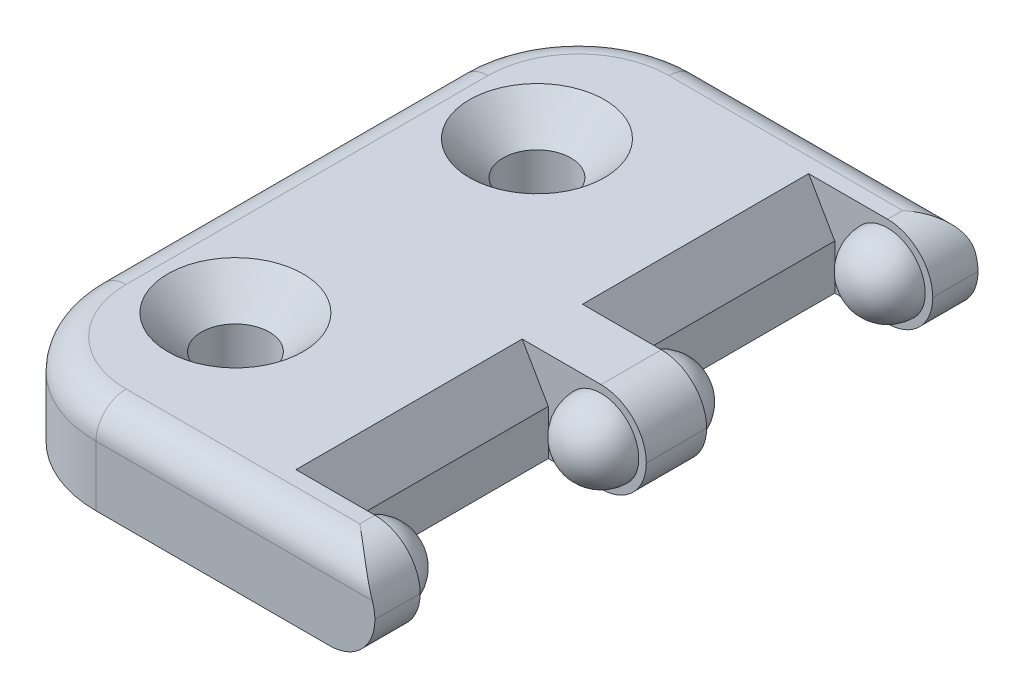
ISO-10303-21;
HEADER;
FILE_DESCRIPTION(('STEP AP214'),'2;1');
FILE_NAME('part.step','',(''),(''),'','','');
FILE_SCHEMA(('AUTOMOTIVE_DESIGN { 1 0 10303 214 1 1 1 1 }'));
ENDSEC;
DATA;
#1=APPLICATION_CONTEXT('core data for automotive mechanical design processes');
#2=APPLICATION_PROTOCOL_DEFINITION('international standard','automotive_design',2000,#1);
#3=PRODUCT_CONTEXT('',#1,'mechanical');
#4=PRODUCT('Part','Part','',(#3));
#5=PRODUCT_RELATED_PRODUCT_CATEGORY('part','',(#4));
#6=PRODUCT_DEFINITION_FORMATION('','',#4);
#7=PRODUCT_DEFINITION_CONTEXT('part definition',#1,'design');
#8=PRODUCT_DEFINITION('design','',#6,#7);
#9=PRODUCT_DEFINITION_SHAPE('','',#8);
#10=(LENGTH_UNIT() NAMED_UNIT(*) SI_UNIT(.MILLI.,.METRE.));
#11=(NAMED_UNIT(*) PLANE_ANGLE_UNIT() SI_UNIT($,.RADIAN.));
#12=(NAMED_UNIT(*) SI_UNIT($,.STERADIAN.) SOLID_ANGLE_UNIT());
#13=UNCERTAINTY_MEASURE_WITH_UNIT(LENGTH_MEASURE(1.E-05),#10,'distance_accuracy_value','');
#14=(GEOMETRIC_REPRESENTATION_CONTEXT(3) GLOBAL_UNCERTAINTY_ASSIGNED_CONTEXT((#13)) GLOBAL_UNIT_ASSIGNED_CONTEXT((#10,
#11,#12)) REPRESENTATION_CONTEXT('',''));
#15=CARTESIAN_POINT('',(0.,0.,0.));
#16=DIRECTION('',(0.,0.,1.));
#17=DIRECTION('',(1.,0.,0.));
#18=AXIS2_PLACEMENT_3D('',#15,#16,#17);
#19=CARTESIAN_POINT('',(-10.,6.,20.));
#20=DIRECTION('',(1.,0.,0.));
#21=DIRECTION('',(0.,0.,-1.));
#22=AXIS2_PLACEMENT_3D('',#19,#20,#21);
#23=PLANE('',#22);
#24=DIRECTION('',(0.,-1.,0.));
#25=VECTOR('',#24,1.);
#26=CARTESIAN_POINT('',(-10.,6.,12.));
#27=LINE('',#26,#25);
#28=CARTESIAN_POINT('',(-10.,0.,12.));
#29=VERTEX_POINT('',#28);
#30=CARTESIAN_POINT('',(-10.,4.,12.));
#31=VERTEX_POINT('',#30);
#32=EDGE_CURVE('E273',#29,#31,#27,.F.);
#33=ORIENTED_EDGE('',*,*,#32,.T.);
#34=DIRECTION('',(0.,0.,1.));
#35=VECTOR('',#34,1.);
#36=CARTESIAN_POINT('',(-10.,4.,-12.));
#37=LINE('',#36,#35);
#38=CARTESIAN_POINT('',(-10.,4.,-12.));
#39=VERTEX_POINT('',#38);
#40=EDGE_CURVE('E418',#31,#39,#37,.F.);
#41=ORIENTED_EDGE('',*,*,#40,.T.);
#42=DIRECTION('',(0.,-1.,0.));
#43=VECTOR('',#42,1.);
#44=CARTESIAN_POINT('',(-10.,6.,-12.));
#45=LINE('',#44,#43);
#46=CARTESIAN_POINT('',(-10.,0.,-12.));
#47=VERTEX_POINT('',#46);
#48=EDGE_CURVE('E287',#39,#47,#45,.T.);
#49=ORIENTED_EDGE('',*,*,#48,.T.);
#50=DIRECTION('',(0.,0.,1.));
#51=VECTOR('',#50,1.);
#52=CARTESIAN_POINT('',(-10.,0.,20.));
#53=LINE('',#52,#51);
#54=EDGE_CURVE('E280',#47,#29,#53,.T.);
#55=ORIENTED_EDGE('',*,*,#54,.T.);
#56=EDGE_LOOP('',(#33,#41,#49,#55));
#57=FACE_BOUND('',#56,.T.);
#58=ADVANCED_FACE('F43',(#57),#23,.F.);
#59=CARTESIAN_POINT('',(10.,6.,20.));
#60=DIRECTION('',(0.,0.,-1.));
#61=DIRECTION('',(-1.,0.,0.));
#62=AXIS2_PLACEMENT_3D('',#59,#60,#61);
#63=PLANE('',#62);
#64=CARTESIAN_POINT('',(13.5,3.,20.));
#65=DIRECTION('',(0.,0.,-1.));
#66=DIRECTION('',(-1.,0.,0.));
#67=AXIS2_PLACEMENT_3D('',#64,#65,#66);
#68=CIRCLE('',#67,3.);
#69=CARTESIAN_POINT('',(16.5,3.,20.));
#70=VERTEX_POINT('',#69);
#71=CARTESIAN_POINT('',(16.3284271247462,4.,20.));
#72=VERTEX_POINT('',#71);
#73=EDGE_CURVE('E269',#70,#72,#68,.F.);
#74=ORIENTED_EDGE('',*,*,#73,.T.);
#75=DIRECTION('',(1.,0.,0.));
#76=VECTOR('',#75,1.);
#77=CARTESIAN_POINT('',(-2.,4.,20.));
#78=LINE('',#77,#76);
#79=CARTESIAN_POINT('',(-2.,4.,20.));
#80=VERTEX_POINT('',#79);
#81=EDGE_CURVE('E316',#72,#80,#78,.F.);
#82=ORIENTED_EDGE('',*,*,#81,.T.);
#83=DIRECTION('',(0.,-1.,0.));
#84=VECTOR('',#83,1.);
#85=CARTESIAN_POINT('',(-2.,6.,20.));
#86=LINE('',#85,#84);
#87=CARTESIAN_POINT('',(-2.,0.,20.));
#88=VERTEX_POINT('',#87);
#89=EDGE_CURVE('E296',#80,#88,#86,.T.);
#90=ORIENTED_EDGE('',*,*,#89,.T.);
#91=DIRECTION('',(1.,0.,0.));
#92=VECTOR('',#91,1.);
#93=CARTESIAN_POINT('',(10.,0.,20.));
#94=LINE('',#93,#92);
#95=CARTESIAN_POINT('',(13.5,0.,20.));
#96=VERTEX_POINT('',#95);
#97=EDGE_CURVE('E209',#88,#96,#94,.T.);
#98=ORIENTED_EDGE('',*,*,#97,.T.);
#99=CARTESIAN_POINT('',(13.5,3.,20.));
#100=DIRECTION('',(0.,0.,-1.));
#101=DIRECTION('',(-1.,0.,0.));
#102=AXIS2_PLACEMENT_3D('',#99,#100,#101);
#103=CIRCLE('',#102,3.);
#104=EDGE_CURVE('E271',#96,#70,#103,.F.);
#105=ORIENTED_EDGE('',*,*,#104,.T.);
#106=EDGE_LOOP('',(#74,#82,#90,#98,#105));
#107=FACE_BOUND('',#106,.T.);
#108=ADVANCED_FACE('F347',(#107),#63,.F.);
#109=CARTESIAN_POINT('',(16.5,6.,17.));
#110=DIRECTION('',(0.,0.,1.));
#111=DIRECTION('',(1.,0.,0.));
#112=AXIS2_PLACEMENT_3D('',#109,#110,#111);
#113=PLANE('',#112);
#114=CARTESIAN_POINT('',(13.5,3.,17.));
#115=DIRECTION('',(0.,0.,-1.));
#116=DIRECTION('',(-1.,0.,0.));
#117=AXIS2_PLACEMENT_3D('',#114,#115,#116);
#118=CIRCLE('',#117,2.5);
#119=CARTESIAN_POINT('',(11.,3.,17.));
#120=VERTEX_POINT('',#119);
#121=EDGE_CURVE('E742',#120,#120,#118,.T.);
#122=ORIENTED_EDGE('',*,*,#121,.F.);
#123=EDGE_LOOP('',(#122));
#124=FACE_BOUND('',#123,.T.);
#125=CARTESIAN_POINT('',(13.5,3.,17.));
#126=DIRECTION('',(0.,0.,1.));
#127=DIRECTION('',(1.,0.,0.));
#128=AXIS2_PLACEMENT_3D('',#125,#126,#127);
#129=CIRCLE('',#128,3.);
#130=CARTESIAN_POINT('',(13.5,6.,17.));
#131=VERTEX_POINT('',#130);
#132=CARTESIAN_POINT('',(16.5,3.,17.));
#133=VERTEX_POINT('',#132);
#134=EDGE_CURVE('E270',#131,#133,#129,.F.);
#135=ORIENTED_EDGE('',*,*,#134,.T.);
#136=CARTESIAN_POINT('',(13.5,3.,17.));
#137=DIRECTION('',(0.,0.,1.));
#138=DIRECTION('',(1.,0.,0.));
#139=AXIS2_PLACEMENT_3D('',#136,#137,#138);
#140=CIRCLE('',#139,3.);
#141=CARTESIAN_POINT('',(13.5,0.,17.));
#142=VERTEX_POINT('',#141);
#143=EDGE_CURVE('E204',#133,#142,#140,.F.);
#144=ORIENTED_EDGE('',*,*,#143,.T.);
#145=DIRECTION('',(-1.,0.,0.));
#146=VECTOR('',#145,1.);
#147=CARTESIAN_POINT('',(16.5,0.,17.));
#148=LINE('',#147,#146);
#149=CARTESIAN_POINT('',(10.,0.,17.));
#150=VERTEX_POINT('',#149);
#151=EDGE_CURVE('E205',#142,#150,#148,.T.);
#152=ORIENTED_EDGE('',*,*,#151,.T.);
#153=DIRECTION('',(0.,-1.,0.));
#154=VECTOR('',#153,1.);
#155=CARTESIAN_POINT('',(10.,6.,17.));
#156=LINE('',#155,#154);
#157=CARTESIAN_POINT('',(10.,2.99999999999999,17.));
#158=VERTEX_POINT('',#157);
#159=EDGE_CURVE('E188',#158,#150,#156,.T.);
#160=ORIENTED_EDGE('',*,*,#159,.F.);
#161=DIRECTION('',(-0.499999999999998,0.86602540378444,0.));
#162=VECTOR('',#161,1.);
#163=CARTESIAN_POINT('',(10.3259618943233,2.43541743770059,17.));
#164=LINE('',#163,#162);
#165=CARTESIAN_POINT('',(8.26794919243113,6.,17.));
#166=VERTEX_POINT('',#165);
#167=EDGE_CURVE('E11',#158,#166,#164,.T.);
#168=ORIENTED_EDGE('',*,*,#167,.T.);
#169=DIRECTION('',(-1.,0.,0.));
#170=VECTOR('',#169,1.);
#171=CARTESIAN_POINT('',(16.5,6.,17.));
#172=LINE('',#171,#170);
#173=EDGE_CURVE('E235',#131,#166,#172,.T.);
#174=ORIENTED_EDGE('',*,*,#173,.F.);
#175=EDGE_LOOP('',(#135,#144,#152,#160,#168,#174));
#176=FACE_BOUND('',#175,.T.);
#177=ADVANCED_FACE('F203',(#124,#176),#113,.F.);
#178=CARTESIAN_POINT('',(10.,6.,17.));
#179=DIRECTION('',(-1.,0.,0.));
#180=DIRECTION('',(0.,0.,1.));
#181=AXIS2_PLACEMENT_3D('',#178,#179,#180);
#182=PLANE('',#181);
#183=DIRECTION('',(0.,-1.,0.));
#184=VECTOR('',#183,1.);
#185=CARTESIAN_POINT('',(10.,6.,2.));
#186=LINE('',#185,#184);
#187=CARTESIAN_POINT('',(10.,2.99999999999999,2.));
#188=VERTEX_POINT('',#187);
#189=CARTESIAN_POINT('',(10.,0.,2.));
#190=VERTEX_POINT('',#189);
#191=EDGE_CURVE('E199',#188,#190,#186,.T.);
#192=ORIENTED_EDGE('',*,*,#191,.F.);
#193=DIRECTION('',(0.,0.,1.));
#194=VECTOR('',#193,1.);
#195=CARTESIAN_POINT('',(10.,2.99999999999999,17.));
#196=LINE('',#195,#194);
#197=EDGE_CURVE('E56',#188,#158,#196,.T.);
#198=ORIENTED_EDGE('',*,*,#197,.T.);
#199=ORIENTED_EDGE('',*,*,#159,.T.);
#200=DIRECTION('',(0.,0.,-1.));
#201=VECTOR('',#200,1.);
#202=CARTESIAN_POINT('',(10.,0.,17.));
#203=LINE('',#202,#201);
#204=EDGE_CURVE('E195',#150,#190,#203,.T.);
#205=ORIENTED_EDGE('',*,*,#204,.T.);
#206=EDGE_LOOP('',(#192,#198,#199,#205));
#207=FACE_BOUND('',#206,.T.);
#208=ADVANCED_FACE('F194',(#207),#182,.F.);
#209=CARTESIAN_POINT('',(10.,6.,2.));
#210=DIRECTION('',(0.,0.,-1.));
#211=DIRECTION('',(-1.,0.,0.));
#212=AXIS2_PLACEMENT_3D('',#209,#210,#211);
#213=PLANE('',#212);
#214=CARTESIAN_POINT('',(13.5,3.,2.));
#215=DIRECTION('',(0.,0.,-1.));
#216=DIRECTION('',(-1.,0.,0.));
#217=AXIS2_PLACEMENT_3D('',#214,#215,#216);
#218=CIRCLE('',#217,2.5);
#219=CARTESIAN_POINT('',(11.,3.,2.));
#220=VERTEX_POINT('',#219);
#221=EDGE_CURVE('E286',#220,#220,#218,.T.);
#222=ORIENTED_EDGE('',*,*,#221,.T.);
#223=EDGE_LOOP('',(#222));
#224=FACE_BOUND('',#223,.T.);
#225=DIRECTION('',(1.,0.,0.));
#226=VECTOR('',#225,1.);
#227=CARTESIAN_POINT('',(10.,0.,2.));
#228=LINE('',#227,#226);
#229=CARTESIAN_POINT('',(13.5,0.,2.));
#230=VERTEX_POINT('',#229);
#231=EDGE_CURVE('E211',#190,#230,#228,.T.);
#232=ORIENTED_EDGE('',*,*,#231,.T.);
#233=CARTESIAN_POINT('',(13.5,3.,2.));
#234=DIRECTION('',(0.,0.,-1.));
#235=DIRECTION('',(-1.,0.,0.));
#236=AXIS2_PLACEMENT_3D('',#233,#234,#235);
#237=CIRCLE('',#236,3.);
#238=CARTESIAN_POINT('',(16.5,3.,2.));
#239=VERTEX_POINT('',#238);
#240=EDGE_CURVE('E262',#230,#239,#237,.F.);
#241=ORIENTED_EDGE('',*,*,#240,.T.);
#242=CARTESIAN_POINT('',(13.5,3.,2.));
#243=DIRECTION('',(0.,0.,-1.));
#244=DIRECTION('',(-1.,0.,0.));
#245=AXIS2_PLACEMENT_3D('',#242,#243,#244);
#246=CIRCLE('',#245,3.);
#247=CARTESIAN_POINT('',(13.5,6.,2.));
#248=VERTEX_POINT('',#247);
#249=EDGE_CURVE('E261',#239,#248,#246,.F.);
#250=ORIENTED_EDGE('',*,*,#249,.T.);
#251=DIRECTION('',(1.,0.,0.));
#252=VECTOR('',#251,1.);
#253=CARTESIAN_POINT('',(10.,6.,2.));
#254=LINE('',#253,#252);
#255=CARTESIAN_POINT('',(8.26794919243113,6.,2.));
#256=VERTEX_POINT('',#255);
#257=EDGE_CURVE('E481',#256,#248,#254,.T.);
#258=ORIENTED_EDGE('',*,*,#257,.F.);
#259=DIRECTION('',(0.499999999999998,-0.86602540378444,0.));
#260=VECTOR('',#259,1.);
#261=CARTESIAN_POINT('',(8.70096189432334,5.25,2.));
#262=LINE('',#261,#260);
#263=EDGE_CURVE('E55',#256,#188,#262,.T.);
#264=ORIENTED_EDGE('',*,*,#263,.T.);
#265=ORIENTED_EDGE('',*,*,#191,.T.);
#266=EDGE_LOOP('',(#232,#241,#250,#258,#264,#265));
#267=FACE_BOUND('',#266,.T.);
#268=ADVANCED_FACE('F471',(#224,#267),#213,.F.);
#269=CARTESIAN_POINT('',(10.,6.,-2.));
#270=DIRECTION('',(0.,0.,1.));
#271=DIRECTION('',(1.,0.,0.));
#272=AXIS2_PLACEMENT_3D('',#269,#270,#271);
#273=PLANE('',#272);
#274=CARTESIAN_POINT('',(13.5,3.,-2.));
#275=DIRECTION('',(0.,0.,-1.));
#276=DIRECTION('',(-1.,0.,0.));
#277=AXIS2_PLACEMENT_3D('',#274,#275,#276);
#278=CIRCLE('',#277,2.5);
#279=CARTESIAN_POINT('',(11.,3.,-2.));
#280=VERTEX_POINT('',#279);
#281=EDGE_CURVE('E739',#280,#280,#278,.T.);
#282=ORIENTED_EDGE('',*,*,#281,.F.);
#283=EDGE_LOOP('',(#282));
#284=FACE_BOUND('',#283,.T.);
#285=CARTESIAN_POINT('',(13.5,3.,-2.));
#286=DIRECTION('',(0.,0.,1.));
#287=DIRECTION('',(1.,0.,0.));
#288=AXIS2_PLACEMENT_3D('',#285,#286,#287);
#289=CIRCLE('',#288,3.);
#290=CARTESIAN_POINT('',(13.5,6.,-2.));
#291=VERTEX_POINT('',#290);
#292=CARTESIAN_POINT('',(16.5,3.,-2.));
#293=VERTEX_POINT('',#292);
#294=EDGE_CURVE('E260',#291,#293,#289,.F.);
#295=ORIENTED_EDGE('',*,*,#294,.T.);
#296=CARTESIAN_POINT('',(13.5,3.,-2.));
#297=DIRECTION('',(0.,0.,1.));
#298=DIRECTION('',(1.,0.,0.));
#299=AXIS2_PLACEMENT_3D('',#296,#297,#298);
#300=CIRCLE('',#299,3.);
#301=CARTESIAN_POINT('',(13.5,0.,-2.));
#302=VERTEX_POINT('',#301);
#303=EDGE_CURVE('E263',#293,#302,#300,.F.);
#304=ORIENTED_EDGE('',*,*,#303,.T.);
#305=DIRECTION('',(-1.,0.,0.));
#306=VECTOR('',#305,1.);
#307=CARTESIAN_POINT('',(10.,0.,-2.));
#308=LINE('',#307,#306);
#309=CARTESIAN_POINT('',(10.,0.,-2.));
#310=VERTEX_POINT('',#309);
#311=EDGE_CURVE('E220',#302,#310,#308,.T.);
#312=ORIENTED_EDGE('',*,*,#311,.T.);
#313=DIRECTION('',(0.,-1.,0.));
#314=VECTOR('',#313,1.);
#315=CARTESIAN_POINT('',(10.,6.,-2.));
#316=LINE('',#315,#314);
#317=CARTESIAN_POINT('',(10.,2.99999999999999,-2.));
#318=VERTEX_POINT('',#317);
#319=EDGE_CURVE('E232',#318,#310,#316,.T.);
#320=ORIENTED_EDGE('',*,*,#319,.F.);
#321=DIRECTION('',(-0.499999999999998,0.86602540378444,0.));
#322=VECTOR('',#321,1.);
#323=CARTESIAN_POINT('',(8.70096189432334,5.25,-2.));
#324=LINE('',#323,#322);
#325=CARTESIAN_POINT('',(8.26794919243113,6.,-2.));
#326=VERTEX_POINT('',#325);
#327=EDGE_CURVE('E399',#318,#326,#324,.T.);
#328=ORIENTED_EDGE('',*,*,#327,.T.);
#329=DIRECTION('',(-1.,0.,0.));
#330=VECTOR('',#329,1.);
#331=CARTESIAN_POINT('',(10.,6.,-2.));
#332=LINE('',#331,#330);
#333=EDGE_CURVE('E477',#291,#326,#332,.T.);
#334=ORIENTED_EDGE('',*,*,#333,.F.);
#335=EDGE_LOOP('',(#295,#304,#312,#320,#328,#334));
#336=FACE_BOUND('',#335,.T.);
#337=ADVANCED_FACE('F485',(#284,#336),#273,.F.);
#338=CARTESIAN_POINT('',(10.,6.,-17.));
#339=DIRECTION('',(-1.,0.,0.));
#340=DIRECTION('',(0.,0.,1.));
#341=AXIS2_PLACEMENT_3D('',#338,#339,#340);
#342=PLANE('',#341);
#343=DIRECTION('',(0.,-1.,0.));
#344=VECTOR('',#343,1.);
#345=CARTESIAN_POINT('',(10.,6.,-17.));
#346=LINE('',#345,#344);
#347=CARTESIAN_POINT('',(10.,2.99999999999999,-17.));
#348=VERTEX_POINT('',#347);
#349=CARTESIAN_POINT('',(10.,0.,-17.));
#350=VERTEX_POINT('',#349);
#351=EDGE_CURVE('E231',#348,#350,#346,.T.);
#352=ORIENTED_EDGE('',*,*,#351,.F.);
#353=DIRECTION('',(0.,0.,1.));
#354=VECTOR('',#353,1.);
#355=CARTESIAN_POINT('',(10.,2.99999999999999,-2.));
#356=LINE('',#355,#354);
#357=EDGE_CURVE('E405',#348,#318,#356,.T.);
#358=ORIENTED_EDGE('',*,*,#357,.T.);
#359=ORIENTED_EDGE('',*,*,#319,.T.);
#360=DIRECTION('',(0.,0.,-1.));
#361=VECTOR('',#360,1.);
#362=CARTESIAN_POINT('',(10.,0.,-17.));
#363=LINE('',#362,#361);
#364=EDGE_CURVE('E223',#310,#350,#363,.T.);
#365=ORIENTED_EDGE('',*,*,#364,.T.);
#366=EDGE_LOOP('',(#352,#358,#359,#365));
#367=FACE_BOUND('',#366,.T.);
#368=ADVANCED_FACE('F466',(#367),#342,.F.);
#369=CARTESIAN_POINT('',(16.5,6.,-17.));
#370=DIRECTION('',(0.,0.,-1.));
#371=DIRECTION('',(-1.,0.,0.));
#372=AXIS2_PLACEMENT_3D('',#369,#370,#371);
#373=PLANE('',#372);
#374=CARTESIAN_POINT('',(13.5,3.,-17.));
#375=DIRECTION('',(0.,0.,-1.));
#376=DIRECTION('',(-1.,0.,0.));
#377=AXIS2_PLACEMENT_3D('',#374,#375,#376);
#378=CIRCLE('',#377,2.5);
#379=CARTESIAN_POINT('',(11.,3.,-17.));
#380=VERTEX_POINT('',#379);
#381=EDGE_CURVE('E736',#380,#380,#378,.T.);
#382=ORIENTED_EDGE('',*,*,#381,.T.);
#383=EDGE_LOOP('',(#382));
#384=FACE_BOUND('',#383,.T.);
#385=CARTESIAN_POINT('',(13.5,3.,-17.));
#386=DIRECTION('',(0.,0.,-1.));
#387=DIRECTION('',(-1.,0.,0.));
#388=AXIS2_PLACEMENT_3D('',#385,#386,#387);
#389=CIRCLE('',#388,3.);
#390=CARTESIAN_POINT('',(13.5,0.,-17.));
#391=VERTEX_POINT('',#390);
#392=CARTESIAN_POINT('',(16.5,3.,-17.));
#393=VERTEX_POINT('',#392);
#394=EDGE_CURVE('E248',#391,#393,#389,.F.);
#395=ORIENTED_EDGE('',*,*,#394,.T.);
#396=CARTESIAN_POINT('',(13.5,3.,-17.));
#397=DIRECTION('',(0.,0.,-1.));
#398=DIRECTION('',(-1.,0.,0.));
#399=AXIS2_PLACEMENT_3D('',#396,#397,#398);
#400=CIRCLE('',#399,3.);
#401=CARTESIAN_POINT('',(13.5,6.,-17.));
#402=VERTEX_POINT('',#401);
#403=EDGE_CURVE('E252',#393,#402,#400,.F.);
#404=ORIENTED_EDGE('',*,*,#403,.T.);
#405=DIRECTION('',(1.,0.,0.));
#406=VECTOR('',#405,1.);
#407=CARTESIAN_POINT('',(16.5,6.,-17.));
#408=LINE('',#407,#406);
#409=CARTESIAN_POINT('',(8.26794919243113,6.,-17.));
#410=VERTEX_POINT('',#409);
#411=EDGE_CURVE('E236',#410,#402,#408,.T.);
#412=ORIENTED_EDGE('',*,*,#411,.F.);
#413=DIRECTION('',(0.499999999999998,-0.86602540378444,0.));
#414=VECTOR('',#413,1.);
#415=CARTESIAN_POINT('',(10.3259618943233,2.43541743770059,-17.));
#416=LINE('',#415,#414);
#417=EDGE_CURVE('E407',#410,#348,#416,.T.);
#418=ORIENTED_EDGE('',*,*,#417,.T.);
#419=ORIENTED_EDGE('',*,*,#351,.T.);
#420=DIRECTION('',(1.,0.,0.));
#421=VECTOR('',#420,1.);
#422=CARTESIAN_POINT('',(16.5,0.,-17.));
#423=LINE('',#422,#421);
#424=EDGE_CURVE('E228',#350,#391,#423,.T.);
#425=ORIENTED_EDGE('',*,*,#424,.T.);
#426=EDGE_LOOP('',(#395,#404,#412,#418,#419,#425));
#427=FACE_BOUND('',#426,.T.);
#428=ADVANCED_FACE('F464',(#384,#427),#373,.F.);
#429=CARTESIAN_POINT('',(10.,6.,-20.));
#430=DIRECTION('',(0.,0.,1.));
#431=DIRECTION('',(1.,0.,0.));
#432=AXIS2_PLACEMENT_3D('',#429,#430,#431);
#433=PLANE('',#432);
#434=DIRECTION('',(0.,-1.,0.));
#435=VECTOR('',#434,1.);
#436=CARTESIAN_POINT('',(-2.00000000000001,6.,-20.));
#437=LINE('',#436,#435);
#438=CARTESIAN_POINT('',(-2.00000000000001,0.,-20.));
#439=VERTEX_POINT('',#438);
#440=CARTESIAN_POINT('',(-2.00000000000001,4.,-20.));
#441=VERTEX_POINT('',#440);
#442=EDGE_CURVE('E294',#439,#441,#437,.F.);
#443=ORIENTED_EDGE('',*,*,#442,.T.);
#444=DIRECTION('',(-1.,0.,0.));
#445=VECTOR('',#444,1.);
#446=CARTESIAN_POINT('',(13.5,4.,-20.));
#447=LINE('',#446,#445);
#448=CARTESIAN_POINT('',(16.3284271247462,4.,-20.));
#449=VERTEX_POINT('',#448);
#450=EDGE_CURVE('E380',#441,#449,#447,.F.);
#451=ORIENTED_EDGE('',*,*,#450,.T.);
#452=CARTESIAN_POINT('',(13.5,3.,-20.));
#453=DIRECTION('',(0.,0.,1.));
#454=DIRECTION('',(1.,0.,0.));
#455=AXIS2_PLACEMENT_3D('',#452,#453,#454);
#456=CIRCLE('',#455,3.);
#457=CARTESIAN_POINT('',(16.5,3.,-20.));
#458=VERTEX_POINT('',#457);
#459=EDGE_CURVE('E250',#449,#458,#456,.F.);
#460=ORIENTED_EDGE('',*,*,#459,.T.);
#461=CARTESIAN_POINT('',(13.5,3.,-20.));
#462=DIRECTION('',(0.,0.,1.));
#463=DIRECTION('',(1.,0.,0.));
#464=AXIS2_PLACEMENT_3D('',#461,#462,#463);
#465=CIRCLE('',#464,3.);
#466=CARTESIAN_POINT('',(13.5,0.,-20.));
#467=VERTEX_POINT('',#466);
#468=EDGE_CURVE('E244',#458,#467,#465,.F.);
#469=ORIENTED_EDGE('',*,*,#468,.T.);
#470=DIRECTION('',(-1.,0.,0.));
#471=VECTOR('',#470,1.);
#472=CARTESIAN_POINT('',(10.,0.,-20.));
#473=LINE('',#472,#471);
#474=EDGE_CURVE('E230',#467,#439,#473,.T.);
#475=ORIENTED_EDGE('',*,*,#474,.T.);
#476=EDGE_LOOP('',(#443,#451,#460,#469,#475));
#477=FACE_BOUND('',#476,.T.);
#478=ADVANCED_FACE('F442',(#477),#433,.F.);
#479=CARTESIAN_POINT('',(0.,6.,0.));
#480=DIRECTION('',(0.,1.,0.));
#481=DIRECTION('',(0.,0.,1.));
#482=AXIS2_PLACEMENT_3D('',#479,#480,#481);
#483=PLANE('',#482);
#484=CARTESIAN_POINT('',(-2.75,6.,-10.));
#485=DIRECTION('',(0.,1.,0.));
#486=DIRECTION('',(0.,0.,1.));
#487=AXIS2_PLACEMENT_3D('',#484,#485,#486);
#488=CIRCLE('',#487,4.48);
#489=CARTESIAN_POINT('',(-2.75,6.,-5.52));
#490=VERTEX_POINT('',#489);
#491=EDGE_CURVE('E422',#490,#490,#488,.T.);
#492=ORIENTED_EDGE('',*,*,#491,.F.);
#493=EDGE_LOOP('',(#492));
#494=FACE_BOUND('',#493,.T.);
#495=CARTESIAN_POINT('',(-2.75,6.,10.));
#496=DIRECTION('',(0.,1.,0.));
#497=DIRECTION('',(0.,0.,1.));
#498=AXIS2_PLACEMENT_3D('',#495,#496,#497);
#499=CIRCLE('',#498,4.48);
#500=CARTESIAN_POINT('',(-2.75,6.,14.48));
#501=VERTEX_POINT('',#500);
#502=EDGE_CURVE('E760',#501,#501,#499,.T.);
#503=ORIENTED_EDGE('',*,*,#502,.F.);
#504=EDGE_LOOP('',(#503));
#505=FACE_BOUND('',#504,.T.);
#506=DIRECTION('',(0.,0.,-1.));
#507=VECTOR('',#506,1.);
#508=CARTESIAN_POINT('',(8.26794919243113,6.,-17.));
#509=LINE('',#508,#507);
#510=EDGE_CURVE('E404',#326,#410,#509,.T.);
#511=ORIENTED_EDGE('',*,*,#510,.T.);
#512=ORIENTED_EDGE('',*,*,#411,.T.);
#513=DIRECTION('',(0.,0.,-1.));
#514=VECTOR('',#513,1.);
#515=CARTESIAN_POINT('',(13.5,6.,-20.));
#516=LINE('',#515,#514);
#517=CARTESIAN_POINT('',(13.5,6.,-18.));
#518=VERTEX_POINT('',#517);
#519=EDGE_CURVE('E245',#402,#518,#516,.T.);
#520=ORIENTED_EDGE('',*,*,#519,.T.);
#521=DIRECTION('',(-1.,0.,0.));
#522=VECTOR('',#521,1.);
#523=CARTESIAN_POINT('',(-2.00000000000001,6.,-18.));
#524=LINE('',#523,#522);
#525=CARTESIAN_POINT('',(-2.00000000000001,6.,-18.));
#526=VERTEX_POINT('',#525);
#527=EDGE_CURVE('E306',#518,#526,#524,.T.);
#528=ORIENTED_EDGE('',*,*,#527,.T.);
#529=CARTESIAN_POINT('',(-2.,6.,-12.));
#530=DIRECTION('',(0.,1.,0.));
#531=DIRECTION('',(0.,0.,1.));
#532=AXIS2_PLACEMENT_3D('',#529,#530,#531);
#533=CIRCLE('',#532,6.);
#534=CARTESIAN_POINT('',(-8.,6.,-12.));
#535=VERTEX_POINT('',#534);
#536=EDGE_CURVE('E302',#526,#535,#533,.T.);
#537=ORIENTED_EDGE('',*,*,#536,.T.);
#538=DIRECTION('',(0.,0.,1.));
#539=VECTOR('',#538,1.);
#540=CARTESIAN_POINT('',(-8.,6.,12.));
#541=LINE('',#540,#539);
#542=CARTESIAN_POINT('',(-8.,6.,12.));
#543=VERTEX_POINT('',#542);
#544=EDGE_CURVE('E297',#535,#543,#541,.T.);
#545=ORIENTED_EDGE('',*,*,#544,.T.);
#546=CARTESIAN_POINT('',(-2.,6.,12.));
#547=DIRECTION('',(0.,1.,0.));
#548=DIRECTION('',(0.,0.,1.));
#549=AXIS2_PLACEMENT_3D('',#546,#547,#548);
#550=CIRCLE('',#549,6.);
#551=CARTESIAN_POINT('',(-2.,6.,18.));
#552=VERTEX_POINT('',#551);
#553=EDGE_CURVE('E305',#543,#552,#550,.T.);
#554=ORIENTED_EDGE('',*,*,#553,.T.);
#555=DIRECTION('',(1.,0.,0.));
#556=VECTOR('',#555,1.);
#557=CARTESIAN_POINT('',(13.5,6.,18.));
#558=LINE('',#557,#556);
#559=CARTESIAN_POINT('',(13.5,6.,18.));
#560=VERTEX_POINT('',#559);
#561=EDGE_CURVE('E308',#552,#560,#558,.T.);
#562=ORIENTED_EDGE('',*,*,#561,.T.);
#563=DIRECTION('',(0.,0.,-1.));
#564=VECTOR('',#563,1.);
#565=CARTESIAN_POINT('',(13.5,6.,17.));
#566=LINE('',#565,#564);
#567=EDGE_CURVE('E196',#560,#131,#566,.T.);
#568=ORIENTED_EDGE('',*,*,#567,.T.);
#569=ORIENTED_EDGE('',*,*,#173,.T.);
#570=DIRECTION('',(0.,0.,-1.));
#571=VECTOR('',#570,1.);
#572=CARTESIAN_POINT('',(8.26794919243113,6.,2.));
#573=LINE('',#572,#571);
#574=EDGE_CURVE('E412',#166,#256,#573,.T.);
#575=ORIENTED_EDGE('',*,*,#574,.T.);
#576=ORIENTED_EDGE('',*,*,#257,.T.);
#577=DIRECTION('',(0.,0.,-1.));
#578=VECTOR('',#577,1.);
#579=CARTESIAN_POINT('',(13.5,6.,-2.));
#580=LINE('',#579,#578);
#581=EDGE_CURVE('E239',#248,#291,#580,.T.);
#582=ORIENTED_EDGE('',*,*,#581,.T.);
#583=ORIENTED_EDGE('',*,*,#333,.T.);
#584=EDGE_LOOP('',(#511,#512,#520,#528,#537,#545,#554,#562,#568,#569,#575,#576,#582,#583));
#585=FACE_BOUND('',#584,.T.);
#586=ADVANCED_FACE('F454',(#494,#505,#585),#483,.T.);
#587=CARTESIAN_POINT('',(0.,0.,0.));
#588=DIRECTION('',(0.,1.,0.));
#589=DIRECTION('',(0.,0.,1.));
#590=AXIS2_PLACEMENT_3D('',#587,#588,#589);
#591=PLANE('',#590);
#592=CARTESIAN_POINT('',(-2.75,0.,-10.));
#593=DIRECTION('',(0.,1.,0.));
#594=DIRECTION('',(0.,0.,1.));
#595=AXIS2_PLACEMENT_3D('',#592,#593,#594);
#596=CIRCLE('',#595,2.25);
#597=CARTESIAN_POINT('',(-2.75,0.,-7.75));
#598=VERTEX_POINT('',#597);
#599=EDGE_CURVE('E759',#598,#598,#596,.T.);
#600=ORIENTED_EDGE('',*,*,#599,.T.);
#601=EDGE_LOOP('',(#600));
#602=FACE_BOUND('',#601,.T.);
#603=CARTESIAN_POINT('',(-2.75,0.,10.));
#604=DIRECTION('',(0.,1.,0.));
#605=DIRECTION('',(0.,0.,1.));
#606=AXIS2_PLACEMENT_3D('',#603,#604,#605);
#607=CIRCLE('',#606,2.25);
#608=CARTESIAN_POINT('',(-2.75,0.,12.25));
#609=VERTEX_POINT('',#608);
#610=EDGE_CURVE('E753',#609,#609,#607,.T.);
#611=ORIENTED_EDGE('',*,*,#610,.T.);
#612=EDGE_LOOP('',(#611));
#613=FACE_BOUND('',#612,.T.);
#614=ORIENTED_EDGE('',*,*,#54,.F.);
#615=CARTESIAN_POINT('',(-2.,0.,-12.));
#616=DIRECTION('',(0.,1.,0.));
#617=DIRECTION('',(0.,0.,1.));
#618=AXIS2_PLACEMENT_3D('',#615,#616,#617);
#619=CIRCLE('',#618,8.);
#620=EDGE_CURVE('E291',#47,#439,#619,.F.);
#621=ORIENTED_EDGE('',*,*,#620,.T.);
#622=ORIENTED_EDGE('',*,*,#474,.F.);
#623=DIRECTION('',(0.,0.,-1.));
#624=VECTOR('',#623,1.);
#625=CARTESIAN_POINT('',(13.5,0.,0.));
#626=LINE('',#625,#624);
#627=EDGE_CURVE('E259',#467,#391,#626,.F.);
#628=ORIENTED_EDGE('',*,*,#627,.T.);
#629=ORIENTED_EDGE('',*,*,#424,.F.);
#630=ORIENTED_EDGE('',*,*,#364,.F.);
#631=ORIENTED_EDGE('',*,*,#311,.F.);
#632=DIRECTION('',(0.,0.,-1.));
#633=VECTOR('',#632,1.);
#634=CARTESIAN_POINT('',(13.5,0.,0.));
#635=LINE('',#634,#633);
#636=EDGE_CURVE('E253',#302,#230,#635,.F.);
#637=ORIENTED_EDGE('',*,*,#636,.T.);
#638=ORIENTED_EDGE('',*,*,#231,.F.);
#639=ORIENTED_EDGE('',*,*,#204,.F.);
#640=ORIENTED_EDGE('',*,*,#151,.F.);
#641=DIRECTION('',(0.,0.,-1.));
#642=VECTOR('',#641,1.);
#643=CARTESIAN_POINT('',(13.5,0.,0.));
#644=LINE('',#643,#642);
#645=EDGE_CURVE('E254',#142,#96,#644,.F.);
#646=ORIENTED_EDGE('',*,*,#645,.T.);
#647=ORIENTED_EDGE('',*,*,#97,.F.);
#648=CARTESIAN_POINT('',(-2.,0.,12.));
#649=DIRECTION('',(0.,1.,0.));
#650=DIRECTION('',(0.,0.,1.));
#651=AXIS2_PLACEMENT_3D('',#648,#649,#650);
#652=CIRCLE('',#651,8.);
#653=EDGE_CURVE('E293',#88,#29,#652,.F.);
#654=ORIENTED_EDGE('',*,*,#653,.T.);
#655=EDGE_LOOP('',(#614,#621,#622,#628,#629,#630,#631,#637,#638,#639,#640,#646,#647,#654));
#656=FACE_BOUND('',#655,.T.);
#657=ADVANCED_FACE('F214',(#602,#613,#656),#591,.F.);
#658=CARTESIAN_POINT('',(13.5,3.,-20.));
#659=DIRECTION('',(0.,0.,-1.));
#660=DIRECTION('',(-1.,0.,0.));
#661=AXIS2_PLACEMENT_3D('',#658,#659,#660);
#662=CYLINDRICAL_SURFACE('',#661,3.);
#663=DIRECTION('',(0.,0.,-1.));
#664=VECTOR('',#663,1.);
#665=CARTESIAN_POINT('',(16.5,3.,-20.));
#666=LINE('',#665,#664);
#667=EDGE_CURVE('E278',#393,#458,#666,.T.);
#668=ORIENTED_EDGE('',*,*,#667,.F.);
#669=ORIENTED_EDGE('',*,*,#394,.F.);
#670=ORIENTED_EDGE('',*,*,#627,.F.);
#671=ORIENTED_EDGE('',*,*,#468,.F.);
#672=EDGE_LOOP('',(#668,#669,#670,#671));
#673=FACE_BOUND('',#672,.T.);
#674=ADVANCED_FACE('F366',(#673),#662,.T.);
#675=CARTESIAN_POINT('',(13.5,3.,0.));
#676=DIRECTION('',(0.,0.,1.));
#677=DIRECTION('',(1.,0.,0.));
#678=AXIS2_PLACEMENT_3D('',#675,#676,#677);
#679=CYLINDRICAL_SURFACE('',#678,3.);
#680=ORIENTED_EDGE('',*,*,#459,.F.);
#681=CARTESIAN_POINT('',(16.3284271247462,4.,-20.));
#682=CARTESIAN_POINT('',(16.3085070502688,4.05638405555257,-20.0000084449649));
#683=CARTESIAN_POINT('',(16.286886973048,4.11213090524145,-19.9976165290429));
#684=CARTESIAN_POINT('',(16.2405472122196,4.22185097214105,-19.9884161031397));
#685=CARTESIAN_POINT('',(16.2158323213147,4.27582677235699,-19.9816143557198));
#686=CARTESIAN_POINT('',(16.1638043245425,4.38114703210529,-19.9640650089645));
#687=CARTESIAN_POINT('',(16.1365199223747,4.43251253251163,-19.9533578782159));
#688=CARTESIAN_POINT('',(16.0794299188087,4.53293300898971,-19.928383343086));
#689=CARTESIAN_POINT('',(16.049623133967,4.58198688350807,-19.9141142613294));
#690=CARTESIAN_POINT('',(15.9427647951933,4.74710684622474,-19.8593269063569));
#691=CARTESIAN_POINT('',(15.8600093087302,4.85695114231588,-19.8107991236013));
#692=CARTESIAN_POINT('',(15.6844718166551,5.06066196172696,-19.699579870891));
#693=CARTESIAN_POINT('',(15.5916463864372,5.15445439532711,-19.6368256750297));
#694=CARTESIAN_POINT('',(15.3616923966539,5.35925720363039,-19.4749333169946));
#695=CARTESIAN_POINT('',(15.2213141580627,5.46289727870954,-19.3711102120254));
#696=CARTESIAN_POINT('',(14.9322217094586,5.64153331793482,-19.1512915720566));
#697=CARTESIAN_POINT('',(14.783496123637,5.7164890478937,-19.0352792281827));
#698=CARTESIAN_POINT('',(14.5408862776506,5.81536669032298,-18.8432419274776));
#699=CARTESIAN_POINT('',(14.4485230844081,5.84775479636274,-18.769505033522));
#700=CARTESIAN_POINT('',(14.2625127889543,5.90310220476015,-18.6201250475232));
#701=CARTESIAN_POINT('',(14.1688652730567,5.92605839166327,-18.5444813343815));
#702=CARTESIAN_POINT('',(13.8871097494622,5.98105514873023,-18.3160659756589));
#703=CARTESIAN_POINT('',(13.6976116741131,5.9994534063341,-18.1613491422741));
#704=CARTESIAN_POINT('',(13.5056567697599,5.99999599518123,-18.004618731357));
#705=CARTESIAN_POINT('',(13.502828339584,5.99999999478464,-18.002309327745));
#706=CARTESIAN_POINT('',(13.5,6.,-18.));
#707=B_SPLINE_CURVE_WITH_KNOTS('',3,(#681,#682,#683,#684,#685,#686,#687,#688,#689,#690,#691,
#692,#693,#694,#695,#696,#697,#698,#699,#700,#701,#702,#703,#704,#705,#706),.UNSPECIFIED.,.F.,
.F.,(4,2,2,2,2,2,2,2,2,2,2,2,4),(0.,0.179272158824226,0.358270048541719,0.535463494925258,
0.712740542250159,1.14766579663324,1.58454732757419,2.19039501983591,2.79708941843105,
3.16434808038176,3.53172795410126,4.26418943717289,4.2751438948957),.UNSPECIFIED.);
#708=EDGE_CURVE('E369',#449,#518,#707,.T.);
#709=ORIENTED_EDGE('',*,*,#708,.T.);
#710=ORIENTED_EDGE('',*,*,#519,.F.);
#711=ORIENTED_EDGE('',*,*,#403,.F.);
#712=ORIENTED_EDGE('',*,*,#667,.T.);
#713=EDGE_LOOP('',(#680,#709,#710,#711,#712));
#714=FACE_BOUND('',#713,.T.);
#715=ADVANCED_FACE('F363',(#714),#679,.T.);
#716=CARTESIAN_POINT('',(13.5,3.,0.));
#717=DIRECTION('',(0.,0.,1.));
#718=DIRECTION('',(1.,0.,0.));
#719=AXIS2_PLACEMENT_3D('',#716,#717,#718);
#720=CYLINDRICAL_SURFACE('',#719,3.);
#721=ORIENTED_EDGE('',*,*,#581,.F.);
#722=ORIENTED_EDGE('',*,*,#249,.F.);
#723=DIRECTION('',(0.,0.,-1.));
#724=VECTOR('',#723,1.);
#725=CARTESIAN_POINT('',(16.5,3.,2.));
#726=LINE('',#725,#724);
#727=EDGE_CURVE('E276',#293,#239,#726,.F.);
#728=ORIENTED_EDGE('',*,*,#727,.F.);
#729=ORIENTED_EDGE('',*,*,#294,.F.);
#730=EDGE_LOOP('',(#721,#722,#728,#729));
#731=FACE_BOUND('',#730,.T.);
#732=ADVANCED_FACE('F362',(#731),#720,.T.);
#733=CARTESIAN_POINT('',(13.5,3.,-2.));
#734=DIRECTION('',(0.,0.,-1.));
#735=DIRECTION('',(-1.,0.,0.));
#736=AXIS2_PLACEMENT_3D('',#733,#734,#735);
#737=CYLINDRICAL_SURFACE('',#736,3.);
#738=ORIENTED_EDGE('',*,*,#240,.F.);
#739=ORIENTED_EDGE('',*,*,#636,.F.);
#740=ORIENTED_EDGE('',*,*,#303,.F.);
#741=ORIENTED_EDGE('',*,*,#727,.T.);
#742=EDGE_LOOP('',(#738,#739,#740,#741));
#743=FACE_BOUND('',#742,.T.);
#744=ADVANCED_FACE('F331',(#743),#737,.T.);
#745=CARTESIAN_POINT('',(13.5,3.,0.));
#746=DIRECTION('',(0.,0.,1.));
#747=DIRECTION('',(1.,0.,0.));
#748=AXIS2_PLACEMENT_3D('',#745,#746,#747);
#749=CYLINDRICAL_SURFACE('',#748,3.);
#750=ORIENTED_EDGE('',*,*,#567,.F.);
#751=CARTESIAN_POINT('',(16.3284271247462,4.,20.));
#752=CARTESIAN_POINT('',(16.3085070502688,4.05638405555257,20.0000084449649));
#753=CARTESIAN_POINT('',(16.286886973048,4.11213090524145,19.9976165290429));
#754=CARTESIAN_POINT('',(16.2405472122196,4.22185097214105,19.9884161031397));
#755=CARTESIAN_POINT('',(16.2158323213147,4.27582677235699,19.9816143557198));
#756=CARTESIAN_POINT('',(16.1638043245425,4.38114703210529,19.9640650089645));
#757=CARTESIAN_POINT('',(16.1365199223747,4.43251253251162,19.9533578782159));
#758=CARTESIAN_POINT('',(16.0794299188087,4.53293300898971,19.928383343086));
#759=CARTESIAN_POINT('',(16.049623133967,4.58198688350807,19.9141142613294));
#760=CARTESIAN_POINT('',(15.9427647951933,4.74710684622474,19.8593269063569));
#761=CARTESIAN_POINT('',(15.8600093087302,4.85695114231588,19.8107991236012));
#762=CARTESIAN_POINT('',(15.6844718166551,5.06066196172696,19.699579870891));
#763=CARTESIAN_POINT('',(15.5916463864372,5.15445439532711,19.6368256750297));
#764=CARTESIAN_POINT('',(15.3616923966539,5.35925720363039,19.4749333169946));
#765=CARTESIAN_POINT('',(15.2213141580627,5.46289727870954,19.3711102120254));
#766=CARTESIAN_POINT('',(14.9322217094586,5.64153331793483,19.1512915720566));
#767=CARTESIAN_POINT('',(14.783496123637,5.7164890478937,19.0352792281827));
#768=CARTESIAN_POINT('',(14.5408862776506,5.81536669032298,18.8432419274776));
#769=CARTESIAN_POINT('',(14.4485230844081,5.84775479636274,18.769505033522));
#770=CARTESIAN_POINT('',(14.2625127889543,5.90310220476016,18.6201250475232));
#771=CARTESIAN_POINT('',(14.1688652730567,5.92605839166327,18.5444813343815));
#772=CARTESIAN_POINT('',(13.8871097494622,5.98105514873023,18.3160659756589));
#773=CARTESIAN_POINT('',(13.6976116741132,5.9994534063341,18.161349142274));
#774=CARTESIAN_POINT('',(13.5056567697599,5.99999599518123,18.004618731357));
#775=CARTESIAN_POINT('',(13.502828339584,5.99999999478464,18.002309327745));
#776=CARTESIAN_POINT('',(13.5,6.,18.));
#777=B_SPLINE_CURVE_WITH_KNOTS('',3,(#751,#752,#753,#754,#755,#756,#757,#758,#759,#760,#761,
#762,#763,#764,#765,#766,#767,#768,#769,#770,#771,#772,#773,#774,#775,#776),.UNSPECIFIED.,.F.,
.F.,(4,2,2,2,2,2,2,2,2,2,2,2,4),(0.,0.179272158824226,0.358270048541719,0.535463494925254,
0.712740542250159,1.14766579663325,1.58454732757419,2.19039501983591,2.79708941843106,
3.16434808038176,3.53172795410126,4.26418943717289,4.2751438948957),.UNSPECIFIED.);
#778=EDGE_CURVE('E311',#560,#72,#777,.F.);
#779=ORIENTED_EDGE('',*,*,#778,.T.);
#780=ORIENTED_EDGE('',*,*,#73,.F.);
#781=DIRECTION('',(0.,0.,-1.));
#782=VECTOR('',#781,1.);
#783=CARTESIAN_POINT('',(16.5,3.,20.));
#784=LINE('',#783,#782);
#785=EDGE_CURVE('E281',#133,#70,#784,.F.);
#786=ORIENTED_EDGE('',*,*,#785,.F.);
#787=ORIENTED_EDGE('',*,*,#134,.F.);
#788=EDGE_LOOP('',(#750,#779,#780,#786,#787));
#789=FACE_BOUND('',#788,.T.);
#790=ADVANCED_FACE('F321',(#789),#749,.T.);
#791=CARTESIAN_POINT('',(13.5,3.,20.));
#792=DIRECTION('',(0.,0.,-1.));
#793=DIRECTION('',(-1.,0.,0.));
#794=AXIS2_PLACEMENT_3D('',#791,#792,#793);
#795=CYLINDRICAL_SURFACE('',#794,3.);
#796=ORIENTED_EDGE('',*,*,#104,.F.);
#797=ORIENTED_EDGE('',*,*,#645,.F.);
#798=ORIENTED_EDGE('',*,*,#143,.F.);
#799=ORIENTED_EDGE('',*,*,#785,.T.);
#800=EDGE_LOOP('',(#796,#797,#798,#799));
#801=FACE_BOUND('',#800,.T.);
#802=ADVANCED_FACE('F327',(#801),#795,.T.);
#803=CARTESIAN_POINT('',(13.5,3.00000000000001,2.));
#804=DIRECTION('',(0.,0.,-1.));
#805=DIRECTION('',(0.,1.,0.));
#806=AXIS2_PLACEMENT_3D('',#803,#804,#805);
#807=SPHERICAL_SURFACE('',#806,2.49999999999999);
#808=ORIENTED_EDGE('',*,*,#221,.F.);
#809=EDGE_LOOP('',(#808));
#810=FACE_BOUND('',#809,.T.);
#811=ADVANCED_FACE('F600',(#810),#807,.T.);
#812=CARTESIAN_POINT('',(13.5,3.00000000000001,-17.));
#813=DIRECTION('',(0.,0.,-1.));
#814=DIRECTION('',(0.,1.,0.));
#815=AXIS2_PLACEMENT_3D('',#812,#813,#814);
#816=SPHERICAL_SURFACE('',#815,2.49999999999999);
#817=ORIENTED_EDGE('',*,*,#381,.F.);
#818=EDGE_LOOP('',(#817));
#819=FACE_BOUND('',#818,.T.);
#820=ADVANCED_FACE('F590',(#819),#816,.T.);
#821=CARTESIAN_POINT('',(13.5,3.00000000000001,-2.));
#822=DIRECTION('',(0.,0.,1.));
#823=DIRECTION('',(0.,1.,0.));
#824=AXIS2_PLACEMENT_3D('',#821,#822,#823);
#825=SPHERICAL_SURFACE('',#824,2.49999999999999);
#826=ORIENTED_EDGE('',*,*,#281,.T.);
#827=EDGE_LOOP('',(#826));
#828=FACE_BOUND('',#827,.T.);
#829=ADVANCED_FACE('F580',(#828),#825,.T.);
#830=CARTESIAN_POINT('',(13.5,3.00000000000001,17.));
#831=DIRECTION('',(0.,0.,1.));
#832=DIRECTION('',(0.,1.,0.));
#833=AXIS2_PLACEMENT_3D('',#830,#831,#832);
#834=SPHERICAL_SURFACE('',#833,2.49999999999999);
#835=ORIENTED_EDGE('',*,*,#121,.T.);
#836=EDGE_LOOP('',(#835));
#837=FACE_BOUND('',#836,.T.);
#838=ADVANCED_FACE('F570',(#837),#834,.T.);
#839=CARTESIAN_POINT('',(-2.75,6.,10.));
#840=DIRECTION('',(0.,1.,0.));
#841=DIRECTION('',(0.,0.,1.));
#842=AXIS2_PLACEMENT_3D('',#839,#840,#841);
#843=CYLINDRICAL_SURFACE('',#842,2.25);
#844=ORIENTED_EDGE('',*,*,#610,.F.);
#845=EDGE_LOOP('',(#844));
#846=FACE_BOUND('',#845,.T.);
#847=CARTESIAN_POINT('',(-2.75,3.77,10.));
#848=DIRECTION('',(0.,1.,0.));
#849=DIRECTION('',(0.,0.,1.));
#850=AXIS2_PLACEMENT_3D('',#847,#848,#849);
#851=CIRCLE('',#850,2.25);
#852=CARTESIAN_POINT('',(-2.75,3.77,12.25));
#853=VERTEX_POINT('',#852);
#854=EDGE_CURVE('E754',#853,#853,#851,.T.);
#855=ORIENTED_EDGE('',*,*,#854,.T.);
#856=EDGE_LOOP('',(#855));
#857=FACE_BOUND('',#856,.T.);
#858=ADVANCED_FACE('F560',(#846,#857),#843,.F.);
#859=CARTESIAN_POINT('',(-2.75,6.,10.));
#860=DIRECTION('',(0.,1.,0.));
#861=DIRECTION('',(0.,0.,1.));
#862=AXIS2_PLACEMENT_3D('',#859,#860,#861);
#863=CONICAL_SURFACE('',#862,4.48,0.785398163397448);
#864=ORIENTED_EDGE('',*,*,#854,.F.);
#865=EDGE_LOOP('',(#864));
#866=FACE_BOUND('',#865,.T.);
#867=ORIENTED_EDGE('',*,*,#502,.T.);
#868=EDGE_LOOP('',(#867));
#869=FACE_BOUND('',#868,.T.);
#870=ADVANCED_FACE('F550',(#866,#869),#863,.F.);
#871=CARTESIAN_POINT('',(-2.75,6.,-10.));
#872=DIRECTION('',(0.,1.,0.));
#873=DIRECTION('',(0.,0.,1.));
#874=AXIS2_PLACEMENT_3D('',#871,#872,#873);
#875=CYLINDRICAL_SURFACE('',#874,2.25);
#876=ORIENTED_EDGE('',*,*,#599,.F.);
#877=EDGE_LOOP('',(#876));
#878=FACE_BOUND('',#877,.T.);
#879=CARTESIAN_POINT('',(-2.75,3.77,-10.));
#880=DIRECTION('',(0.,1.,0.));
#881=DIRECTION('',(0.,0.,1.));
#882=AXIS2_PLACEMENT_3D('',#879,#880,#881);
#883=CIRCLE('',#882,2.25);
#884=CARTESIAN_POINT('',(-2.75,3.77,-7.75));
#885=VERTEX_POINT('',#884);
#886=EDGE_CURVE('E763',#885,#885,#883,.T.);
#887=ORIENTED_EDGE('',*,*,#886,.T.);
#888=EDGE_LOOP('',(#887));
#889=FACE_BOUND('',#888,.T.);
#890=ADVANCED_FACE('F539',(#878,#889),#875,.F.);
#891=CARTESIAN_POINT('',(-2.75,6.,-10.));
#892=DIRECTION('',(0.,1.,0.));
#893=DIRECTION('',(0.,0.,1.));
#894=AXIS2_PLACEMENT_3D('',#891,#892,#893);
#895=CONICAL_SURFACE('',#894,4.48,0.785398163397448);
#896=ORIENTED_EDGE('',*,*,#886,.F.);
#897=EDGE_LOOP('',(#896));
#898=FACE_BOUND('',#897,.T.);
#899=ORIENTED_EDGE('',*,*,#491,.T.);
#900=EDGE_LOOP('',(#899));
#901=FACE_BOUND('',#900,.T.);
#902=ADVANCED_FACE('F340',(#898,#901),#895,.F.);
#903=CARTESIAN_POINT('',(-2.,6.,-12.));
#904=DIRECTION('',(0.,-1.,0.));
#905=DIRECTION('',(0.,0.,-1.));
#906=AXIS2_PLACEMENT_3D('',#903,#904,#905);
#907=CYLINDRICAL_SURFACE('',#906,8.);
#908=ORIENTED_EDGE('',*,*,#48,.F.);
#909=CARTESIAN_POINT('',(-2.,4.,-12.));
#910=DIRECTION('',(0.,1.,0.));
#911=DIRECTION('',(0.,0.,1.));
#912=AXIS2_PLACEMENT_3D('',#909,#910,#911);
#913=CIRCLE('',#912,8.);
#914=EDGE_CURVE('E376',#39,#441,#913,.F.);
#915=ORIENTED_EDGE('',*,*,#914,.T.);
#916=ORIENTED_EDGE('',*,*,#442,.F.);
#917=ORIENTED_EDGE('',*,*,#620,.F.);
#918=EDGE_LOOP('',(#908,#915,#916,#917));
#919=FACE_BOUND('',#918,.T.);
#920=ADVANCED_FACE('F332',(#919),#907,.T.);
#921=CARTESIAN_POINT('',(-2.,6.,12.));
#922=DIRECTION('',(0.,-1.,0.));
#923=DIRECTION('',(0.,0.,-1.));
#924=AXIS2_PLACEMENT_3D('',#921,#922,#923);
#925=CYLINDRICAL_SURFACE('',#924,8.);
#926=ORIENTED_EDGE('',*,*,#89,.F.);
#927=CARTESIAN_POINT('',(-2.,4.,12.));
#928=DIRECTION('',(0.,1.,0.));
#929=DIRECTION('',(0.,0.,1.));
#930=AXIS2_PLACEMENT_3D('',#927,#928,#929);
#931=CIRCLE('',#930,8.);
#932=EDGE_CURVE('E435',#80,#31,#931,.F.);
#933=ORIENTED_EDGE('',*,*,#932,.T.);
#934=ORIENTED_EDGE('',*,*,#32,.F.);
#935=ORIENTED_EDGE('',*,*,#653,.F.);
#936=EDGE_LOOP('',(#926,#933,#934,#935));
#937=FACE_BOUND('',#936,.T.);
#938=ADVANCED_FACE('F337',(#937),#925,.T.);
#939=CARTESIAN_POINT('',(0.,4.,-18.));
#940=DIRECTION('',(1.,0.,0.));
#941=DIRECTION('',(0.,0.,-1.));
#942=AXIS2_PLACEMENT_3D('',#939,#940,#941);
#943=CYLINDRICAL_SURFACE('',#942,2.);
#944=ORIENTED_EDGE('',*,*,#708,.F.);
#945=ORIENTED_EDGE('',*,*,#450,.F.);
#946=CARTESIAN_POINT('',(-2.00000000000001,4.,-18.));
#947=DIRECTION('',(-1.,0.,0.));
#948=DIRECTION('',(0.,0.,1.));
#949=AXIS2_PLACEMENT_3D('',#946,#947,#948);
#950=CIRCLE('',#949,2.);
#951=EDGE_CURVE('E417',#526,#441,#950,.T.);
#952=ORIENTED_EDGE('',*,*,#951,.F.);
#953=ORIENTED_EDGE('',*,*,#527,.F.);
#954=EDGE_LOOP('',(#944,#945,#952,#953));
#955=FACE_BOUND('',#954,.T.);
#956=ADVANCED_FACE('F338',(#955),#943,.T.);
#957=CARTESIAN_POINT('',(-2.,4.,-12.));
#958=DIRECTION('',(0.,1.,0.));
#959=DIRECTION('',(0.,0.,1.));
#960=AXIS2_PLACEMENT_3D('',#957,#958,#959);
#961=TOROIDAL_SURFACE('',#960,6.,2.);
#962=ORIENTED_EDGE('',*,*,#951,.T.);
#963=ORIENTED_EDGE('',*,*,#914,.F.);
#964=CARTESIAN_POINT('',(-8.,4.,-12.));
#965=DIRECTION('',(0.,0.,1.));
#966=DIRECTION('',(1.,0.,0.));
#967=AXIS2_PLACEMENT_3D('',#964,#965,#966);
#968=CIRCLE('',#967,2.);
#969=EDGE_CURVE('E421',#535,#39,#968,.T.);
#970=ORIENTED_EDGE('',*,*,#969,.F.);
#971=ORIENTED_EDGE('',*,*,#536,.F.);
#972=EDGE_LOOP('',(#962,#963,#970,#971));
#973=FACE_BOUND('',#972,.T.);
#974=ADVANCED_FACE('F341',(#973),#961,.T.);
#975=CARTESIAN_POINT('',(-8.,4.,0.));
#976=DIRECTION('',(0.,0.,-1.));
#977=DIRECTION('',(-1.,0.,0.));
#978=AXIS2_PLACEMENT_3D('',#975,#976,#977);
#979=CYLINDRICAL_SURFACE('',#978,2.);
#980=ORIENTED_EDGE('',*,*,#969,.T.);
#981=ORIENTED_EDGE('',*,*,#40,.F.);
#982=CARTESIAN_POINT('',(-8.,4.,12.));
#983=DIRECTION('',(0.,0.,1.));
#984=DIRECTION('',(1.,0.,0.));
#985=AXIS2_PLACEMENT_3D('',#982,#983,#984);
#986=CIRCLE('',#985,2.);
#987=EDGE_CURVE('E428',#543,#31,#986,.T.);
#988=ORIENTED_EDGE('',*,*,#987,.F.);
#989=ORIENTED_EDGE('',*,*,#544,.F.);
#990=EDGE_LOOP('',(#980,#981,#988,#989));
#991=FACE_BOUND('',#990,.T.);
#992=ADVANCED_FACE('F502',(#991),#979,.T.);
#993=CARTESIAN_POINT('',(-2.,4.,12.));
#994=DIRECTION('',(0.,1.,0.));
#995=DIRECTION('',(0.,0.,1.));
#996=AXIS2_PLACEMENT_3D('',#993,#994,#995);
#997=TOROIDAL_SURFACE('',#996,6.,2.);
#998=ORIENTED_EDGE('',*,*,#987,.T.);
#999=ORIENTED_EDGE('',*,*,#932,.F.);
#1000=CARTESIAN_POINT('',(-2.,4.,18.));
#1001=DIRECTION('',(1.,0.,0.));
#1002=DIRECTION('',(0.,0.,-1.));
#1003=AXIS2_PLACEMENT_3D('',#1000,#1001,#1002);
#1004=CIRCLE('',#1003,2.);
#1005=EDGE_CURVE('E429',#552,#80,#1004,.T.);
#1006=ORIENTED_EDGE('',*,*,#1005,.F.);
#1007=ORIENTED_EDGE('',*,*,#553,.F.);
#1008=EDGE_LOOP('',(#998,#999,#1006,#1007));
#1009=FACE_BOUND('',#1008,.T.);
#1010=ADVANCED_FACE('F394',(#1009),#997,.T.);
#1011=CARTESIAN_POINT('',(0.,4.,18.));
#1012=DIRECTION('',(-1.,0.,0.));
#1013=DIRECTION('',(0.,0.,1.));
#1014=AXIS2_PLACEMENT_3D('',#1011,#1012,#1013);
#1015=CYLINDRICAL_SURFACE('',#1014,2.);
#1016=ORIENTED_EDGE('',*,*,#1005,.T.);
#1017=ORIENTED_EDGE('',*,*,#81,.F.);
#1018=ORIENTED_EDGE('',*,*,#778,.F.);
#1019=ORIENTED_EDGE('',*,*,#561,.F.);
#1020=EDGE_LOOP('',(#1016,#1017,#1018,#1019));
#1021=FACE_BOUND('',#1020,.T.);
#1022=ADVANCED_FACE('F323',(#1021),#1015,.T.);
#1023=CARTESIAN_POINT('',(8.26794919243113,6.,0.));
#1024=DIRECTION('',(0.86602540378444,0.499999999999998,0.));
#1025=DIRECTION('',(0.,0.,1.));
#1026=AXIS2_PLACEMENT_3D('',#1023,#1024,#1025);
#1027=PLANE('',#1026);
#1028=ORIENTED_EDGE('',*,*,#327,.F.);
#1029=ORIENTED_EDGE('',*,*,#357,.F.);
#1030=ORIENTED_EDGE('',*,*,#417,.F.);
#1031=ORIENTED_EDGE('',*,*,#510,.F.);
#1032=EDGE_LOOP('',(#1028,#1029,#1030,#1031));
#1033=FACE_BOUND('',#1032,.T.);
#1034=ADVANCED_FACE('F384',(#1033),#1027,.T.);
#1035=CARTESIAN_POINT('',(8.26794919243113,6.,0.));
#1036=DIRECTION('',(0.86602540378444,0.499999999999998,0.));
#1037=DIRECTION('',(0.,0.,1.));
#1038=AXIS2_PLACEMENT_3D('',#1035,#1036,#1037);
#1039=PLANE('',#1038);
#1040=ORIENTED_EDGE('',*,*,#167,.F.);
#1041=ORIENTED_EDGE('',*,*,#197,.F.);
#1042=ORIENTED_EDGE('',*,*,#263,.F.);
#1043=ORIENTED_EDGE('',*,*,#574,.F.);
#1044=EDGE_LOOP('',(#1040,#1041,#1042,#1043));
#1045=FACE_BOUND('',#1044,.T.);
#1046=ADVANCED_FACE('F46',(#1045),#1039,.T.);
#1047=CLOSED_SHELL('',(#58,#108,#177,#208,#268,#337,#368,#428,#478,#586,#657,#674,#715,#732,
#744,#790,#802,#811,#820,#829,#838,#858,#870,#890,#902,#920,#938,#956,#974,#992,#1010,#1022,
#1034,#1046));
#1048=MANIFOLD_SOLID_BREP('B2',#1047);
#1049=ADVANCED_BREP_SHAPE_REPRESENTATION('',(#18,#1048),#14);
#1050=SHAPE_DEFINITION_REPRESENTATION(#9,#1049);
ENDSEC;
END-ISO-10303-21;
